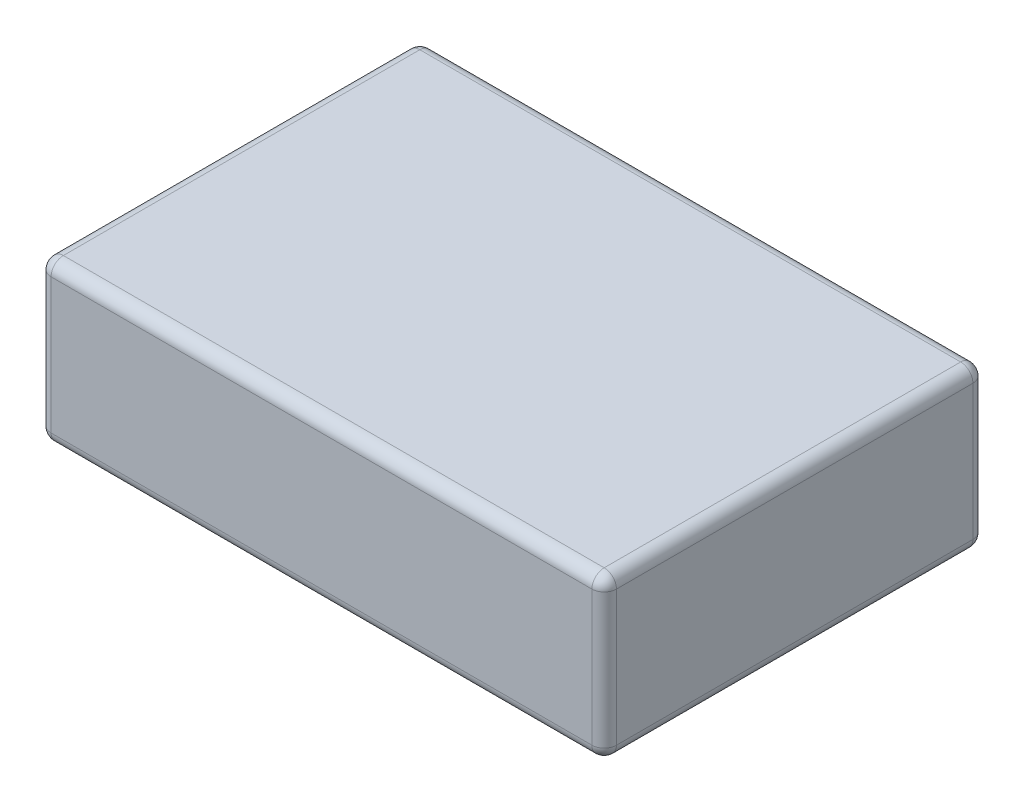
ISO-10303-21;
HEADER;
FILE_DESCRIPTION(('STEP AP214'),'2;1');
FILE_NAME('part.step','',(''),(''),'','','');
FILE_SCHEMA(('AUTOMOTIVE_DESIGN { 1 0 10303 214 1 1 1 1 }'));
ENDSEC;
DATA;
#1=APPLICATION_CONTEXT('core data for automotive mechanical design processes');
#2=APPLICATION_PROTOCOL_DEFINITION('international standard','automotive_design',2000,#1);
#3=PRODUCT_CONTEXT('',#1,'mechanical');
#4=PRODUCT('Part','Part','',(#3));
#5=PRODUCT_RELATED_PRODUCT_CATEGORY('part','',(#4));
#6=PRODUCT_DEFINITION_FORMATION('','',#4);
#7=PRODUCT_DEFINITION_CONTEXT('part definition',#1,'design');
#8=PRODUCT_DEFINITION('design','',#6,#7);
#9=PRODUCT_DEFINITION_SHAPE('','',#8);
#10=(LENGTH_UNIT() NAMED_UNIT(*) SI_UNIT(.MILLI.,.METRE.));
#11=(NAMED_UNIT(*) PLANE_ANGLE_UNIT() SI_UNIT($,.RADIAN.));
#12=(NAMED_UNIT(*) SI_UNIT($,.STERADIAN.) SOLID_ANGLE_UNIT());
#13=UNCERTAINTY_MEASURE_WITH_UNIT(LENGTH_MEASURE(1.E-05),#10,'distance_accuracy_value','');
#14=(GEOMETRIC_REPRESENTATION_CONTEXT(3) GLOBAL_UNCERTAINTY_ASSIGNED_CONTEXT((#13)) GLOBAL_UNIT_ASSIGNED_CONTEXT((#10,
#11,#12)) REPRESENTATION_CONTEXT('',''));
#15=CARTESIAN_POINT('',(0.,0.,0.));
#16=DIRECTION('',(0.,0.,1.));
#17=DIRECTION('',(1.,0.,0.));
#18=AXIS2_PLACEMENT_3D('',#15,#16,#17);
#19=CARTESIAN_POINT('',(46.,26.,-31.));
#20=DIRECTION('',(-1.,0.,0.));
#21=DIRECTION('',(0.,0.,1.));
#22=AXIS2_PLACEMENT_3D('',#19,#20,#21);
#23=PLANE('',#22);
#24=DIRECTION('',(0.,-1.,0.));
#25=VECTOR('',#24,1.);
#26=CARTESIAN_POINT('',(46.,26.,29.));
#27=LINE('',#26,#25);
#28=CARTESIAN_POINT('',(46.,24.,29.));
#29=VERTEX_POINT('',#28);
#30=CARTESIAN_POINT('',(46.,2.,29.));
#31=VERTEX_POINT('',#30);
#32=EDGE_CURVE('E174',#29,#31,#27,.T.);
#33=ORIENTED_EDGE('',*,*,#32,.T.);
#34=DIRECTION('',(0.,0.,-1.));
#35=VECTOR('',#34,1.);
#36=CARTESIAN_POINT('',(46.,2.,-31.));
#37=LINE('',#36,#35);
#38=CARTESIAN_POINT('',(46.,2.,-29.));
#39=VERTEX_POINT('',#38);
#40=EDGE_CURVE('E170',#31,#39,#37,.T.);
#41=ORIENTED_EDGE('',*,*,#40,.T.);
#42=DIRECTION('',(0.,-1.,0.));
#43=VECTOR('',#42,1.);
#44=CARTESIAN_POINT('',(46.,26.,-29.));
#45=LINE('',#44,#43);
#46=CARTESIAN_POINT('',(46.,24.,-29.));
#47=VERTEX_POINT('',#46);
#48=EDGE_CURVE('E165',#39,#47,#45,.F.);
#49=ORIENTED_EDGE('',*,*,#48,.T.);
#50=DIRECTION('',(0.,0.,-1.));
#51=VECTOR('',#50,1.);
#52=CARTESIAN_POINT('',(46.,24.,31.));
#53=LINE('',#52,#51);
#54=EDGE_CURVE('E167',#47,#29,#53,.F.);
#55=ORIENTED_EDGE('',*,*,#54,.T.);
#56=EDGE_LOOP('',(#33,#41,#49,#55));
#57=FACE_BOUND('',#56,.T.);
#58=ADVANCED_FACE('F34',(#57),#23,.F.);
#59=CARTESIAN_POINT('',(-46.,26.,-31.));
#60=DIRECTION('',(0.,0.,1.));
#61=DIRECTION('',(1.,0.,0.));
#62=AXIS2_PLACEMENT_3D('',#59,#60,#61);
#63=PLANE('',#62);
#64=DIRECTION('',(-1.,0.,0.));
#65=VECTOR('',#64,1.);
#66=CARTESIAN_POINT('',(-46.,2.,-31.));
#67=LINE('',#66,#65);
#68=CARTESIAN_POINT('',(44.,2.,-31.));
#69=VERTEX_POINT('',#68);
#70=CARTESIAN_POINT('',(-44.,2.,-31.));
#71=VERTEX_POINT('',#70);
#72=EDGE_CURVE('E313',#69,#71,#67,.T.);
#73=ORIENTED_EDGE('',*,*,#72,.T.);
#74=DIRECTION('',(0.,-1.,0.));
#75=VECTOR('',#74,1.);
#76=CARTESIAN_POINT('',(-44.,26.,-31.));
#77=LINE('',#76,#75);
#78=CARTESIAN_POINT('',(-44.,24.,-31.));
#79=VERTEX_POINT('',#78);
#80=EDGE_CURVE('E316',#71,#79,#77,.F.);
#81=ORIENTED_EDGE('',*,*,#80,.T.);
#82=DIRECTION('',(-1.,0.,0.));
#83=VECTOR('',#82,1.);
#84=CARTESIAN_POINT('',(46.,24.,-31.));
#85=LINE('',#84,#83);
#86=CARTESIAN_POINT('',(44.,24.,-31.));
#87=VERTEX_POINT('',#86);
#88=EDGE_CURVE('E307',#79,#87,#85,.F.);
#89=ORIENTED_EDGE('',*,*,#88,.T.);
#90=DIRECTION('',(0.,-1.,0.));
#91=VECTOR('',#90,1.);
#92=CARTESIAN_POINT('',(44.,26.,-31.));
#93=LINE('',#92,#91);
#94=EDGE_CURVE('E197',#87,#69,#93,.T.);
#95=ORIENTED_EDGE('',*,*,#94,.T.);
#96=EDGE_LOOP('',(#73,#81,#89,#95));
#97=FACE_BOUND('',#96,.T.);
#98=ADVANCED_FACE('F375',(#97),#63,.F.);
#99=CARTESIAN_POINT('',(-46.,26.,-31.));
#100=DIRECTION('',(1.,0.,0.));
#101=DIRECTION('',(0.,0.,-1.));
#102=AXIS2_PLACEMENT_3D('',#99,#100,#101);
#103=PLANE('',#102);
#104=DIRECTION('',(0.,0.,1.));
#105=VECTOR('',#104,1.);
#106=CARTESIAN_POINT('',(-46.,2.,-31.));
#107=LINE('',#106,#105);
#108=CARTESIAN_POINT('',(-46.,2.,-29.));
#109=VERTEX_POINT('',#108);
#110=CARTESIAN_POINT('',(-46.,2.,29.));
#111=VERTEX_POINT('',#110);
#112=EDGE_CURVE('E322',#109,#111,#107,.T.);
#113=ORIENTED_EDGE('',*,*,#112,.T.);
#114=DIRECTION('',(0.,-1.,0.));
#115=VECTOR('',#114,1.);
#116=CARTESIAN_POINT('',(-46.,26.,29.));
#117=LINE('',#116,#115);
#118=CARTESIAN_POINT('',(-46.,24.,29.));
#119=VERTEX_POINT('',#118);
#120=EDGE_CURVE('E325',#111,#119,#117,.F.);
#121=ORIENTED_EDGE('',*,*,#120,.T.);
#122=DIRECTION('',(0.,0.,1.));
#123=VECTOR('',#122,1.);
#124=CARTESIAN_POINT('',(-46.,24.,-31.));
#125=LINE('',#124,#123);
#126=CARTESIAN_POINT('',(-46.,24.,-29.));
#127=VERTEX_POINT('',#126);
#128=EDGE_CURVE('E320',#119,#127,#125,.F.);
#129=ORIENTED_EDGE('',*,*,#128,.T.);
#130=DIRECTION('',(0.,-1.,0.));
#131=VECTOR('',#130,1.);
#132=CARTESIAN_POINT('',(-46.,26.,-29.));
#133=LINE('',#132,#131);
#134=EDGE_CURVE('E318',#127,#109,#133,.T.);
#135=ORIENTED_EDGE('',*,*,#134,.T.);
#136=EDGE_LOOP('',(#113,#121,#129,#135));
#137=FACE_BOUND('',#136,.T.);
#138=ADVANCED_FACE('F379',(#137),#103,.F.);
#139=CARTESIAN_POINT('',(-46.,26.,31.));
#140=DIRECTION('',(0.,0.,-1.));
#141=DIRECTION('',(-1.,0.,0.));
#142=AXIS2_PLACEMENT_3D('',#139,#140,#141);
#143=PLANE('',#142);
#144=DIRECTION('',(1.,0.,0.));
#145=VECTOR('',#144,1.);
#146=CARTESIAN_POINT('',(-46.,2.,31.));
#147=LINE('',#146,#145);
#148=CARTESIAN_POINT('',(-44.,2.,31.));
#149=VERTEX_POINT('',#148);
#150=CARTESIAN_POINT('',(44.,2.,31.));
#151=VERTEX_POINT('',#150);
#152=EDGE_CURVE('E331',#149,#151,#147,.T.);
#153=ORIENTED_EDGE('',*,*,#152,.T.);
#154=DIRECTION('',(0.,-1.,0.));
#155=VECTOR('',#154,1.);
#156=CARTESIAN_POINT('',(44.,26.,31.));
#157=LINE('',#156,#155);
#158=CARTESIAN_POINT('',(44.,24.,31.));
#159=VERTEX_POINT('',#158);
#160=EDGE_CURVE('E334',#151,#159,#157,.F.);
#161=ORIENTED_EDGE('',*,*,#160,.T.);
#162=DIRECTION('',(1.,0.,0.));
#163=VECTOR('',#162,1.);
#164=CARTESIAN_POINT('',(-46.,24.,31.));
#165=LINE('',#164,#163);
#166=CARTESIAN_POINT('',(-44.,24.,31.));
#167=VERTEX_POINT('',#166);
#168=EDGE_CURVE('E329',#159,#167,#165,.F.);
#169=ORIENTED_EDGE('',*,*,#168,.T.);
#170=DIRECTION('',(0.,-1.,0.));
#171=VECTOR('',#170,1.);
#172=CARTESIAN_POINT('',(-44.,26.,31.));
#173=LINE('',#172,#171);
#174=EDGE_CURVE('E327',#167,#149,#173,.T.);
#175=ORIENTED_EDGE('',*,*,#174,.T.);
#176=EDGE_LOOP('',(#153,#161,#169,#175));
#177=FACE_BOUND('',#176,.T.);
#178=ADVANCED_FACE('F385',(#177),#143,.F.);
#179=CARTESIAN_POINT('',(0.,26.,0.));
#180=DIRECTION('',(0.,1.,0.));
#181=DIRECTION('',(0.,0.,1.));
#182=AXIS2_PLACEMENT_3D('',#179,#180,#181);
#183=PLANE('',#182);
#184=DIRECTION('',(0.,0.,-1.));
#185=VECTOR('',#184,1.);
#186=CARTESIAN_POINT('',(44.,26.,-31.));
#187=LINE('',#186,#185);
#188=CARTESIAN_POINT('',(44.,26.,29.));
#189=VERTEX_POINT('',#188);
#190=CARTESIAN_POINT('',(44.,26.,-29.));
#191=VERTEX_POINT('',#190);
#192=EDGE_CURVE('E336',#189,#191,#187,.T.);
#193=ORIENTED_EDGE('',*,*,#192,.T.);
#194=DIRECTION('',(-1.,0.,0.));
#195=VECTOR('',#194,1.);
#196=CARTESIAN_POINT('',(-46.,26.,-29.));
#197=LINE('',#196,#195);
#198=CARTESIAN_POINT('',(-44.,26.,-29.));
#199=VERTEX_POINT('',#198);
#200=EDGE_CURVE('E261',#191,#199,#197,.T.);
#201=ORIENTED_EDGE('',*,*,#200,.T.);
#202=DIRECTION('',(0.,0.,1.));
#203=VECTOR('',#202,1.);
#204=CARTESIAN_POINT('',(-44.,26.,31.));
#205=LINE('',#204,#203);
#206=CARTESIAN_POINT('',(-44.,26.,29.));
#207=VERTEX_POINT('',#206);
#208=EDGE_CURVE('E96',#199,#207,#205,.T.);
#209=ORIENTED_EDGE('',*,*,#208,.T.);
#210=DIRECTION('',(1.,0.,0.));
#211=VECTOR('',#210,1.);
#212=CARTESIAN_POINT('',(46.,26.,29.));
#213=LINE('',#212,#211);
#214=EDGE_CURVE('E265',#207,#189,#213,.T.);
#215=ORIENTED_EDGE('',*,*,#214,.T.);
#216=EDGE_LOOP('',(#193,#201,#209,#215));
#217=FACE_BOUND('',#216,.T.);
#218=ADVANCED_FACE('F338',(#217),#183,.T.);
#219=CARTESIAN_POINT('',(0.,0.,0.));
#220=DIRECTION('',(0.,1.,0.));
#221=DIRECTION('',(0.,0.,1.));
#222=AXIS2_PLACEMENT_3D('',#219,#220,#221);
#223=PLANE('',#222);
#224=DIRECTION('',(-1.,0.,0.));
#225=VECTOR('',#224,1.);
#226=CARTESIAN_POINT('',(0.,0.,-29.));
#227=LINE('',#226,#225);
#228=CARTESIAN_POINT('',(-44.,0.,-29.));
#229=VERTEX_POINT('',#228);
#230=CARTESIAN_POINT('',(44.,0.,-29.));
#231=VERTEX_POINT('',#230);
#232=EDGE_CURVE('E302',#229,#231,#227,.F.);
#233=ORIENTED_EDGE('',*,*,#232,.T.);
#234=DIRECTION('',(0.,0.,-1.));
#235=VECTOR('',#234,1.);
#236=CARTESIAN_POINT('',(44.,0.,0.));
#237=LINE('',#236,#235);
#238=CARTESIAN_POINT('',(44.,0.,29.));
#239=VERTEX_POINT('',#238);
#240=EDGE_CURVE('E299',#231,#239,#237,.F.);
#241=ORIENTED_EDGE('',*,*,#240,.T.);
#242=DIRECTION('',(1.,0.,0.));
#243=VECTOR('',#242,1.);
#244=CARTESIAN_POINT('',(0.,0.,29.));
#245=LINE('',#244,#243);
#246=CARTESIAN_POINT('',(-44.,0.,29.));
#247=VERTEX_POINT('',#246);
#248=EDGE_CURVE('E290',#239,#247,#245,.F.);
#249=ORIENTED_EDGE('',*,*,#248,.T.);
#250=DIRECTION('',(0.,0.,1.));
#251=VECTOR('',#250,1.);
#252=CARTESIAN_POINT('',(-44.,0.,0.));
#253=LINE('',#252,#251);
#254=EDGE_CURVE('E296',#247,#229,#253,.F.);
#255=ORIENTED_EDGE('',*,*,#254,.T.);
#256=EDGE_LOOP('',(#233,#241,#249,#255));
#257=FACE_BOUND('',#256,.T.);
#258=ADVANCED_FACE('F300',(#257),#223,.F.);
#259=CARTESIAN_POINT('',(-44.,24.,0.));
#260=DIRECTION('',(0.,0.,-1.));
#261=DIRECTION('',(-1.,0.,0.));
#262=AXIS2_PLACEMENT_3D('',#259,#260,#261);
#263=CYLINDRICAL_SURFACE('',#262,2.);
#264=CARTESIAN_POINT('',(-44.,24.,29.));
#265=DIRECTION('',(0.,0.,1.));
#266=DIRECTION('',(1.,0.,0.));
#267=AXIS2_PLACEMENT_3D('',#264,#265,#266);
#268=CIRCLE('',#267,2.);
#269=EDGE_CURVE('E186',#207,#119,#268,.T.);
#270=ORIENTED_EDGE('',*,*,#269,.F.);
#271=ORIENTED_EDGE('',*,*,#208,.F.);
#272=CARTESIAN_POINT('',(-44.,24.,-29.));
#273=DIRECTION('',(0.,0.,-1.));
#274=DIRECTION('',(-1.,0.,0.));
#275=AXIS2_PLACEMENT_3D('',#272,#273,#274);
#276=CIRCLE('',#275,2.);
#277=EDGE_CURVE('E236',#127,#199,#276,.T.);
#278=ORIENTED_EDGE('',*,*,#277,.F.);
#279=ORIENTED_EDGE('',*,*,#128,.F.);
#280=EDGE_LOOP('',(#270,#271,#278,#279));
#281=FACE_BOUND('',#280,.T.);
#282=ADVANCED_FACE('F392',(#281),#263,.T.);
#283=CARTESIAN_POINT('',(-44.,24.,29.));
#284=DIRECTION('',(0.,0.,1.));
#285=DIRECTION('',(1.,0.,0.));
#286=AXIS2_PLACEMENT_3D('',#283,#284,#285);
#287=SPHERICAL_SURFACE('',#286,2.);
#288=CARTESIAN_POINT('',(-44.,24.,29.));
#289=DIRECTION('',(-1.,0.,0.));
#290=DIRECTION('',(0.,-1.,0.));
#291=AXIS2_PLACEMENT_3D('',#288,#289,#290);
#292=CIRCLE('',#291,2.);
#293=EDGE_CURVE('E230',#207,#167,#292,.F.);
#294=ORIENTED_EDGE('',*,*,#293,.F.);
#295=ORIENTED_EDGE('',*,*,#269,.T.);
#296=CARTESIAN_POINT('',(-44.,24.,29.));
#297=DIRECTION('',(0.,1.,0.));
#298=DIRECTION('',(0.,0.,1.));
#299=AXIS2_PLACEMENT_3D('',#296,#297,#298);
#300=CIRCLE('',#299,2.);
#301=EDGE_CURVE('E233',#167,#119,#300,.F.);
#302=ORIENTED_EDGE('',*,*,#301,.F.);
#303=EDGE_LOOP('',(#294,#295,#302));
#304=FACE_BOUND('',#303,.T.);
#305=ADVANCED_FACE('F408',(#304),#287,.T.);
#306=CARTESIAN_POINT('',(-44.,24.,-29.));
#307=DIRECTION('',(0.,0.,1.));
#308=DIRECTION('',(1.,0.,0.));
#309=AXIS2_PLACEMENT_3D('',#306,#307,#308);
#310=SPHERICAL_SURFACE('',#309,2.);
#311=CARTESIAN_POINT('',(-44.,24.,-29.));
#312=DIRECTION('',(0.,1.,0.));
#313=DIRECTION('',(0.,0.,1.));
#314=AXIS2_PLACEMENT_3D('',#311,#312,#313);
#315=CIRCLE('',#314,2.);
#316=EDGE_CURVE('E226',#127,#79,#315,.F.);
#317=ORIENTED_EDGE('',*,*,#316,.F.);
#318=ORIENTED_EDGE('',*,*,#277,.T.);
#319=CARTESIAN_POINT('',(-44.,24.,-29.));
#320=DIRECTION('',(-1.,0.,0.));
#321=DIRECTION('',(0.,0.,1.));
#322=AXIS2_PLACEMENT_3D('',#319,#320,#321);
#323=CIRCLE('',#322,2.);
#324=EDGE_CURVE('E88',#79,#199,#323,.F.);
#325=ORIENTED_EDGE('',*,*,#324,.F.);
#326=EDGE_LOOP('',(#317,#318,#325));
#327=FACE_BOUND('',#326,.T.);
#328=ADVANCED_FACE('F416',(#327),#310,.T.);
#329=CARTESIAN_POINT('',(-44.,26.,29.));
#330=DIRECTION('',(0.,-1.,0.));
#331=DIRECTION('',(0.,0.,-1.));
#332=AXIS2_PLACEMENT_3D('',#329,#330,#331);
#333=CYLINDRICAL_SURFACE('',#332,2.);
#334=ORIENTED_EDGE('',*,*,#301,.T.);
#335=ORIENTED_EDGE('',*,*,#120,.F.);
#336=CARTESIAN_POINT('',(-44.,2.,29.));
#337=DIRECTION('',(0.,-1.,0.));
#338=DIRECTION('',(0.,0.,-1.));
#339=AXIS2_PLACEMENT_3D('',#336,#337,#338);
#340=CIRCLE('',#339,2.);
#341=EDGE_CURVE('E221',#149,#111,#340,.T.);
#342=ORIENTED_EDGE('',*,*,#341,.F.);
#343=ORIENTED_EDGE('',*,*,#174,.F.);
#344=EDGE_LOOP('',(#334,#335,#342,#343));
#345=FACE_BOUND('',#344,.T.);
#346=ADVANCED_FACE('F424',(#345),#333,.T.);
#347=CARTESIAN_POINT('',(0.,24.,29.));
#348=DIRECTION('',(-1.,0.,0.));
#349=DIRECTION('',(0.,0.,1.));
#350=AXIS2_PLACEMENT_3D('',#347,#348,#349);
#351=CYLINDRICAL_SURFACE('',#350,2.);
#352=ORIENTED_EDGE('',*,*,#293,.T.);
#353=ORIENTED_EDGE('',*,*,#168,.F.);
#354=CARTESIAN_POINT('',(44.,24.,29.));
#355=DIRECTION('',(1.,0.,0.));
#356=DIRECTION('',(0.,0.,-1.));
#357=AXIS2_PLACEMENT_3D('',#354,#355,#356);
#358=CIRCLE('',#357,2.);
#359=EDGE_CURVE('E218',#189,#159,#358,.T.);
#360=ORIENTED_EDGE('',*,*,#359,.F.);
#361=ORIENTED_EDGE('',*,*,#214,.F.);
#362=EDGE_LOOP('',(#352,#353,#360,#361));
#363=FACE_BOUND('',#362,.T.);
#364=ADVANCED_FACE('F342',(#363),#351,.T.);
#365=CARTESIAN_POINT('',(44.,24.,0.));
#366=DIRECTION('',(0.,0.,1.));
#367=DIRECTION('',(1.,0.,0.));
#368=AXIS2_PLACEMENT_3D('',#365,#366,#367);
#369=CYLINDRICAL_SURFACE('',#368,2.);
#370=CARTESIAN_POINT('',(44.,24.,-29.));
#371=DIRECTION('',(0.,0.,-1.));
#372=DIRECTION('',(-1.,0.,0.));
#373=AXIS2_PLACEMENT_3D('',#370,#371,#372);
#374=CIRCLE('',#373,2.);
#375=EDGE_CURVE('E181',#191,#47,#374,.T.);
#376=ORIENTED_EDGE('',*,*,#375,.F.);
#377=ORIENTED_EDGE('',*,*,#192,.F.);
#378=CARTESIAN_POINT('',(44.,24.,29.));
#379=DIRECTION('',(0.,0.,1.));
#380=DIRECTION('',(1.,0.,0.));
#381=AXIS2_PLACEMENT_3D('',#378,#379,#380);
#382=CIRCLE('',#381,2.);
#383=EDGE_CURVE('E184',#29,#189,#382,.T.);
#384=ORIENTED_EDGE('',*,*,#383,.F.);
#385=ORIENTED_EDGE('',*,*,#54,.F.);
#386=EDGE_LOOP('',(#376,#377,#384,#385));
#387=FACE_BOUND('',#386,.T.);
#388=ADVANCED_FACE('F179',(#387),#369,.T.);
#389=CARTESIAN_POINT('',(0.,24.,-29.));
#390=DIRECTION('',(1.,0.,0.));
#391=DIRECTION('',(0.,0.,-1.));
#392=AXIS2_PLACEMENT_3D('',#389,#390,#391);
#393=CYLINDRICAL_SURFACE('',#392,2.);
#394=ORIENTED_EDGE('',*,*,#324,.T.);
#395=ORIENTED_EDGE('',*,*,#200,.F.);
#396=CARTESIAN_POINT('',(44.,24.,-29.));
#397=DIRECTION('',(1.,0.,0.));
#398=DIRECTION('',(0.,1.,0.));
#399=AXIS2_PLACEMENT_3D('',#396,#397,#398);
#400=CIRCLE('',#399,2.);
#401=EDGE_CURVE('E194',#87,#191,#400,.T.);
#402=ORIENTED_EDGE('',*,*,#401,.F.);
#403=ORIENTED_EDGE('',*,*,#88,.F.);
#404=EDGE_LOOP('',(#394,#395,#402,#403));
#405=FACE_BOUND('',#404,.T.);
#406=ADVANCED_FACE('F445',(#405),#393,.T.);
#407=CARTESIAN_POINT('',(-44.,26.,-29.));
#408=DIRECTION('',(0.,-1.,0.));
#409=DIRECTION('',(0.,0.,-1.));
#410=AXIS2_PLACEMENT_3D('',#407,#408,#409);
#411=CYLINDRICAL_SURFACE('',#410,2.);
#412=ORIENTED_EDGE('',*,*,#316,.T.);
#413=ORIENTED_EDGE('',*,*,#80,.F.);
#414=CARTESIAN_POINT('',(-44.,2.,-29.));
#415=DIRECTION('',(0.,-1.,0.));
#416=DIRECTION('',(0.,0.,-1.));
#417=AXIS2_PLACEMENT_3D('',#414,#415,#416);
#418=CIRCLE('',#417,2.);
#419=EDGE_CURVE('E213',#109,#71,#418,.T.);
#420=ORIENTED_EDGE('',*,*,#419,.F.);
#421=ORIENTED_EDGE('',*,*,#134,.F.);
#422=EDGE_LOOP('',(#412,#413,#420,#421));
#423=FACE_BOUND('',#422,.T.);
#424=ADVANCED_FACE('F452',(#423),#411,.T.);
#425=CARTESIAN_POINT('',(-44.,2.,-31.));
#426=DIRECTION('',(0.,0.,1.));
#427=DIRECTION('',(1.,0.,0.));
#428=AXIS2_PLACEMENT_3D('',#425,#426,#427);
#429=CYLINDRICAL_SURFACE('',#428,2.);
#430=CARTESIAN_POINT('',(-44.,2.,29.));
#431=DIRECTION('',(0.,0.,1.));
#432=DIRECTION('',(1.,0.,0.));
#433=AXIS2_PLACEMENT_3D('',#430,#431,#432);
#434=CIRCLE('',#433,2.);
#435=EDGE_CURVE('E223',#111,#247,#434,.T.);
#436=ORIENTED_EDGE('',*,*,#435,.F.);
#437=ORIENTED_EDGE('',*,*,#112,.F.);
#438=CARTESIAN_POINT('',(-44.,2.,-29.));
#439=DIRECTION('',(0.,0.,-1.));
#440=DIRECTION('',(-1.,0.,0.));
#441=AXIS2_PLACEMENT_3D('',#438,#439,#440);
#442=CIRCLE('',#441,2.);
#443=EDGE_CURVE('E210',#229,#109,#442,.T.);
#444=ORIENTED_EDGE('',*,*,#443,.F.);
#445=ORIENTED_EDGE('',*,*,#254,.F.);
#446=EDGE_LOOP('',(#436,#437,#444,#445));
#447=FACE_BOUND('',#446,.T.);
#448=ADVANCED_FACE('F355',(#447),#429,.T.);
#449=CARTESIAN_POINT('',(-44.,2.,29.));
#450=DIRECTION('',(0.,0.,1.));
#451=DIRECTION('',(1.,0.,0.));
#452=AXIS2_PLACEMENT_3D('',#449,#450,#451);
#453=SPHERICAL_SURFACE('',#452,2.);
#454=ORIENTED_EDGE('',*,*,#341,.T.);
#455=ORIENTED_EDGE('',*,*,#435,.T.);
#456=CARTESIAN_POINT('',(-44.,2.,29.));
#457=DIRECTION('',(-1.,0.,0.));
#458=DIRECTION('',(0.,0.,1.));
#459=AXIS2_PLACEMENT_3D('',#456,#457,#458);
#460=CIRCLE('',#459,2.);
#461=EDGE_CURVE('E202',#149,#247,#460,.F.);
#462=ORIENTED_EDGE('',*,*,#461,.F.);
#463=EDGE_LOOP('',(#454,#455,#462));
#464=FACE_BOUND('',#463,.T.);
#465=ADVANCED_FACE('F466',(#464),#453,.T.);
#466=CARTESIAN_POINT('',(44.,24.,29.));
#467=DIRECTION('',(0.,0.,1.));
#468=DIRECTION('',(1.,0.,0.));
#469=AXIS2_PLACEMENT_3D('',#466,#467,#468);
#470=SPHERICAL_SURFACE('',#469,2.);
#471=ORIENTED_EDGE('',*,*,#383,.T.);
#472=ORIENTED_EDGE('',*,*,#359,.T.);
#473=CARTESIAN_POINT('',(44.,24.,29.));
#474=DIRECTION('',(0.,1.,0.));
#475=DIRECTION('',(0.,0.,1.));
#476=AXIS2_PLACEMENT_3D('',#473,#474,#475);
#477=CIRCLE('',#476,2.);
#478=EDGE_CURVE('E198',#29,#159,#477,.F.);
#479=ORIENTED_EDGE('',*,*,#478,.F.);
#480=EDGE_LOOP('',(#471,#472,#479));
#481=FACE_BOUND('',#480,.T.);
#482=ADVANCED_FACE('F344',(#481),#470,.T.);
#483=CARTESIAN_POINT('',(44.,24.,-29.));
#484=DIRECTION('',(0.,0.,1.));
#485=DIRECTION('',(1.,0.,0.));
#486=AXIS2_PLACEMENT_3D('',#483,#484,#485);
#487=SPHERICAL_SURFACE('',#486,2.);
#488=ORIENTED_EDGE('',*,*,#401,.T.);
#489=ORIENTED_EDGE('',*,*,#375,.T.);
#490=CARTESIAN_POINT('',(44.,24.,-29.));
#491=DIRECTION('',(0.,1.,0.));
#492=DIRECTION('',(0.,0.,1.));
#493=AXIS2_PLACEMENT_3D('',#490,#491,#492);
#494=CIRCLE('',#493,2.);
#495=EDGE_CURVE('E191',#87,#47,#494,.F.);
#496=ORIENTED_EDGE('',*,*,#495,.F.);
#497=EDGE_LOOP('',(#488,#489,#496));
#498=FACE_BOUND('',#497,.T.);
#499=ADVANCED_FACE('F190',(#498),#487,.T.);
#500=CARTESIAN_POINT('',(-44.,2.,-29.));
#501=DIRECTION('',(0.,0.,1.));
#502=DIRECTION('',(1.,0.,0.));
#503=AXIS2_PLACEMENT_3D('',#500,#501,#502);
#504=SPHERICAL_SURFACE('',#503,2.);
#505=ORIENTED_EDGE('',*,*,#443,.T.);
#506=ORIENTED_EDGE('',*,*,#419,.T.);
#507=CARTESIAN_POINT('',(-44.,2.,-29.));
#508=DIRECTION('',(-1.,0.,0.));
#509=DIRECTION('',(0.,0.,1.));
#510=AXIS2_PLACEMENT_3D('',#507,#508,#509);
#511=CIRCLE('',#510,2.);
#512=EDGE_CURVE('E199',#229,#71,#511,.F.);
#513=ORIENTED_EDGE('',*,*,#512,.F.);
#514=EDGE_LOOP('',(#505,#506,#513));
#515=FACE_BOUND('',#514,.T.);
#516=ADVANCED_FACE('F358',(#515),#504,.T.);
#517=CARTESIAN_POINT('',(-46.,2.,29.));
#518=DIRECTION('',(1.,0.,0.));
#519=DIRECTION('',(0.,0.,-1.));
#520=AXIS2_PLACEMENT_3D('',#517,#518,#519);
#521=CYLINDRICAL_SURFACE('',#520,2.);
#522=ORIENTED_EDGE('',*,*,#461,.T.);
#523=ORIENTED_EDGE('',*,*,#248,.F.);
#524=CARTESIAN_POINT('',(44.,2.,29.));
#525=DIRECTION('',(1.,0.,0.));
#526=DIRECTION('',(0.,0.,-1.));
#527=AXIS2_PLACEMENT_3D('',#524,#525,#526);
#528=CIRCLE('',#527,2.);
#529=EDGE_CURVE('E204',#151,#239,#528,.T.);
#530=ORIENTED_EDGE('',*,*,#529,.F.);
#531=ORIENTED_EDGE('',*,*,#152,.F.);
#532=EDGE_LOOP('',(#522,#523,#530,#531));
#533=FACE_BOUND('',#532,.T.);
#534=ADVANCED_FACE('F292',(#533),#521,.T.);
#535=CARTESIAN_POINT('',(44.,26.,29.));
#536=DIRECTION('',(0.,-1.,0.));
#537=DIRECTION('',(0.,0.,-1.));
#538=AXIS2_PLACEMENT_3D('',#535,#536,#537);
#539=CYLINDRICAL_SURFACE('',#538,2.);
#540=ORIENTED_EDGE('',*,*,#478,.T.);
#541=ORIENTED_EDGE('',*,*,#160,.F.);
#542=CARTESIAN_POINT('',(44.,2.,29.));
#543=DIRECTION('',(0.,-1.,0.));
#544=DIRECTION('',(0.,0.,-1.));
#545=AXIS2_PLACEMENT_3D('',#542,#543,#544);
#546=CIRCLE('',#545,2.);
#547=EDGE_CURVE('E279',#31,#151,#546,.T.);
#548=ORIENTED_EDGE('',*,*,#547,.F.);
#549=ORIENTED_EDGE('',*,*,#32,.F.);
#550=EDGE_LOOP('',(#540,#541,#548,#549));
#551=FACE_BOUND('',#550,.T.);
#552=ADVANCED_FACE('F347',(#551),#539,.T.);
#553=CARTESIAN_POINT('',(44.,26.,-29.));
#554=DIRECTION('',(0.,-1.,0.));
#555=DIRECTION('',(0.,0.,-1.));
#556=AXIS2_PLACEMENT_3D('',#553,#554,#555);
#557=CYLINDRICAL_SURFACE('',#556,2.);
#558=ORIENTED_EDGE('',*,*,#495,.T.);
#559=ORIENTED_EDGE('',*,*,#48,.F.);
#560=CARTESIAN_POINT('',(44.,2.,-29.));
#561=DIRECTION('',(0.,-1.,0.));
#562=DIRECTION('',(0.,0.,-1.));
#563=AXIS2_PLACEMENT_3D('',#560,#561,#562);
#564=CIRCLE('',#563,2.);
#565=EDGE_CURVE('E276',#69,#39,#564,.T.);
#566=ORIENTED_EDGE('',*,*,#565,.F.);
#567=ORIENTED_EDGE('',*,*,#94,.F.);
#568=EDGE_LOOP('',(#558,#559,#566,#567));
#569=FACE_BOUND('',#568,.T.);
#570=ADVANCED_FACE('F196',(#569),#557,.T.);
#571=CARTESIAN_POINT('',(-46.,2.,-29.));
#572=DIRECTION('',(-1.,0.,0.));
#573=DIRECTION('',(0.,0.,1.));
#574=AXIS2_PLACEMENT_3D('',#571,#572,#573);
#575=CYLINDRICAL_SURFACE('',#574,2.);
#576=ORIENTED_EDGE('',*,*,#512,.T.);
#577=ORIENTED_EDGE('',*,*,#72,.F.);
#578=CARTESIAN_POINT('',(44.,2.,-29.));
#579=DIRECTION('',(1.,0.,0.));
#580=DIRECTION('',(0.,0.,-1.));
#581=AXIS2_PLACEMENT_3D('',#578,#579,#580);
#582=CIRCLE('',#581,2.);
#583=EDGE_CURVE('E273',#231,#69,#582,.T.);
#584=ORIENTED_EDGE('',*,*,#583,.F.);
#585=ORIENTED_EDGE('',*,*,#232,.F.);
#586=EDGE_LOOP('',(#576,#577,#584,#585));
#587=FACE_BOUND('',#586,.T.);
#588=ADVANCED_FACE('F362',(#587),#575,.T.);
#589=CARTESIAN_POINT('',(44.,2.,29.));
#590=DIRECTION('',(0.,0.,1.));
#591=DIRECTION('',(1.,0.,0.));
#592=AXIS2_PLACEMENT_3D('',#589,#590,#591);
#593=SPHERICAL_SURFACE('',#592,2.);
#594=ORIENTED_EDGE('',*,*,#547,.T.);
#595=ORIENTED_EDGE('',*,*,#529,.T.);
#596=CARTESIAN_POINT('',(44.,2.,29.));
#597=DIRECTION('',(0.,0.,1.));
#598=DIRECTION('',(1.,0.,0.));
#599=AXIS2_PLACEMENT_3D('',#596,#597,#598);
#600=CIRCLE('',#599,2.);
#601=EDGE_CURVE('E271',#31,#239,#600,.F.);
#602=ORIENTED_EDGE('',*,*,#601,.F.);
#603=EDGE_LOOP('',(#594,#595,#602));
#604=FACE_BOUND('',#603,.T.);
#605=ADVANCED_FACE('F285',(#604),#593,.T.);
#606=CARTESIAN_POINT('',(44.,2.,-29.));
#607=DIRECTION('',(0.,0.,1.));
#608=DIRECTION('',(1.,0.,0.));
#609=AXIS2_PLACEMENT_3D('',#606,#607,#608);
#610=SPHERICAL_SURFACE('',#609,2.);
#611=ORIENTED_EDGE('',*,*,#583,.T.);
#612=ORIENTED_EDGE('',*,*,#565,.T.);
#613=CARTESIAN_POINT('',(44.,2.,-29.));
#614=DIRECTION('',(0.,0.,-1.));
#615=DIRECTION('',(-1.,0.,0.));
#616=AXIS2_PLACEMENT_3D('',#613,#614,#615);
#617=CIRCLE('',#616,2.);
#618=EDGE_CURVE('E269',#231,#39,#617,.F.);
#619=ORIENTED_EDGE('',*,*,#618,.F.);
#620=EDGE_LOOP('',(#611,#612,#619));
#621=FACE_BOUND('',#620,.T.);
#622=ADVANCED_FACE('F364',(#621),#610,.T.);
#623=CARTESIAN_POINT('',(44.,2.,-31.));
#624=DIRECTION('',(0.,0.,-1.));
#625=DIRECTION('',(-1.,0.,0.));
#626=AXIS2_PLACEMENT_3D('',#623,#624,#625);
#627=CYLINDRICAL_SURFACE('',#626,2.);
#628=ORIENTED_EDGE('',*,*,#601,.T.);
#629=ORIENTED_EDGE('',*,*,#240,.F.);
#630=ORIENTED_EDGE('',*,*,#618,.T.);
#631=ORIENTED_EDGE('',*,*,#40,.F.);
#632=EDGE_LOOP('',(#628,#629,#630,#631));
#633=FACE_BOUND('',#632,.T.);
#634=ADVANCED_FACE('F365',(#633),#627,.T.);
#635=CLOSED_SHELL('',(#58,#98,#138,#178,#218,#258,#282,#305,#328,#346,#364,#388,#406,#424,#448,
#465,#482,#499,#516,#534,#552,#570,#588,#605,#622,#634));
#636=CARTESIAN_POINT('',(44.,26.,-31.));
#637=DIRECTION('',(-1.,0.,0.));
#638=DIRECTION('',(0.,0.,1.));
#639=AXIS2_PLACEMENT_3D('',#636,#637,#638);
#640=PLANE('',#639);
#641=DIRECTION('',(0.,1.,0.));
#642=VECTOR('',#641,1.);
#643=CARTESIAN_POINT('',(44.,26.,29.));
#644=LINE('',#643,#642);
#645=CARTESIAN_POINT('',(44.,2.,29.));
#646=VERTEX_POINT('',#645);
#647=CARTESIAN_POINT('',(44.,24.,29.));
#648=VERTEX_POINT('',#647);
#649=EDGE_CURVE('E80',#646,#648,#644,.T.);
#650=ORIENTED_EDGE('',*,*,#649,.T.);
#651=DIRECTION('',(0.,0.,-1.));
#652=VECTOR('',#651,1.);
#653=CARTESIAN_POINT('',(44.,24.,-31.));
#654=LINE('',#653,#652);
#655=CARTESIAN_POINT('',(44.,24.,-29.));
#656=VERTEX_POINT('',#655);
#657=EDGE_CURVE('E75',#648,#656,#654,.T.);
#658=ORIENTED_EDGE('',*,*,#657,.T.);
#659=DIRECTION('',(0.,1.,0.));
#660=VECTOR('',#659,1.);
#661=CARTESIAN_POINT('',(44.,26.,-29.));
#662=LINE('',#661,#660);
#663=CARTESIAN_POINT('',(44.,2.,-29.));
#664=VERTEX_POINT('',#663);
#665=EDGE_CURVE('E38',#664,#656,#662,.T.);
#666=ORIENTED_EDGE('',*,*,#665,.F.);
#667=DIRECTION('',(0.,0.,1.));
#668=VECTOR('',#667,1.);
#669=CARTESIAN_POINT('',(44.,2.,0.));
#670=LINE('',#669,#668);
#671=EDGE_CURVE('E45',#664,#646,#670,.T.);
#672=ORIENTED_EDGE('',*,*,#671,.T.);
#673=EDGE_LOOP('',(#650,#658,#666,#672));
#674=FACE_BOUND('',#673,.T.);
#675=ADVANCED_FACE('F536',(#674),#640,.T.);
#676=CARTESIAN_POINT('',(-46.,26.,-29.));
#677=DIRECTION('',(0.,0.,1.));
#678=DIRECTION('',(1.,0.,0.));
#679=AXIS2_PLACEMENT_3D('',#676,#677,#678);
#680=PLANE('',#679);
#681=DIRECTION('',(-1.,0.,0.));
#682=VECTOR('',#681,1.);
#683=CARTESIAN_POINT('',(-46.,2.,-29.));
#684=LINE('',#683,#682);
#685=CARTESIAN_POINT('',(-44.,2.,-29.));
#686=VERTEX_POINT('',#685);
#687=EDGE_CURVE('E256',#664,#686,#684,.T.);
#688=ORIENTED_EDGE('',*,*,#687,.F.);
#689=ORIENTED_EDGE('',*,*,#665,.T.);
#690=DIRECTION('',(-1.,0.,0.));
#691=VECTOR('',#690,1.);
#692=CARTESIAN_POINT('',(-46.,24.,-29.));
#693=LINE('',#692,#691);
#694=CARTESIAN_POINT('',(-44.,24.,-29.));
#695=VERTEX_POINT('',#694);
#696=EDGE_CURVE('E244',#656,#695,#693,.T.);
#697=ORIENTED_EDGE('',*,*,#696,.T.);
#698=DIRECTION('',(0.,1.,0.));
#699=VECTOR('',#698,1.);
#700=CARTESIAN_POINT('',(-44.,26.,-29.));
#701=LINE('',#700,#699);
#702=EDGE_CURVE('E255',#686,#695,#701,.T.);
#703=ORIENTED_EDGE('',*,*,#702,.F.);
#704=EDGE_LOOP('',(#688,#689,#697,#703));
#705=FACE_BOUND('',#704,.T.);
#706=ADVANCED_FACE('F539',(#705),#680,.T.);
#707=CARTESIAN_POINT('',(-44.,26.,-31.));
#708=DIRECTION('',(1.,0.,0.));
#709=DIRECTION('',(0.,0.,-1.));
#710=AXIS2_PLACEMENT_3D('',#707,#708,#709);
#711=PLANE('',#710);
#712=DIRECTION('',(0.,0.,1.));
#713=VECTOR('',#712,1.);
#714=CARTESIAN_POINT('',(-44.,2.,-31.));
#715=LINE('',#714,#713);
#716=CARTESIAN_POINT('',(-44.,2.,29.));
#717=VERTEX_POINT('',#716);
#718=EDGE_CURVE('E54',#686,#717,#715,.T.);
#719=ORIENTED_EDGE('',*,*,#718,.F.);
#720=ORIENTED_EDGE('',*,*,#702,.T.);
#721=DIRECTION('',(0.,0.,1.));
#722=VECTOR('',#721,1.);
#723=CARTESIAN_POINT('',(-44.,24.,-31.));
#724=LINE('',#723,#722);
#725=CARTESIAN_POINT('',(-44.,24.,29.));
#726=VERTEX_POINT('',#725);
#727=EDGE_CURVE('E241',#695,#726,#724,.T.);
#728=ORIENTED_EDGE('',*,*,#727,.T.);
#729=DIRECTION('',(0.,1.,0.));
#730=VECTOR('',#729,1.);
#731=CARTESIAN_POINT('',(-44.,26.,29.));
#732=LINE('',#731,#730);
#733=EDGE_CURVE('E251',#717,#726,#732,.T.);
#734=ORIENTED_EDGE('',*,*,#733,.F.);
#735=EDGE_LOOP('',(#719,#720,#728,#734));
#736=FACE_BOUND('',#735,.T.);
#737=ADVANCED_FACE('F550',(#736),#711,.T.);
#738=CARTESIAN_POINT('',(-46.,26.,29.));
#739=DIRECTION('',(0.,0.,-1.));
#740=DIRECTION('',(-1.,0.,0.));
#741=AXIS2_PLACEMENT_3D('',#738,#739,#740);
#742=PLANE('',#741);
#743=DIRECTION('',(-1.,0.,0.));
#744=VECTOR('',#743,1.);
#745=CARTESIAN_POINT('',(0.,2.,29.));
#746=LINE('',#745,#744);
#747=EDGE_CURVE('E11',#646,#717,#746,.T.);
#748=ORIENTED_EDGE('',*,*,#747,.T.);
#749=ORIENTED_EDGE('',*,*,#733,.T.);
#750=DIRECTION('',(-1.,0.,0.));
#751=VECTOR('',#750,1.);
#752=CARTESIAN_POINT('',(0.,24.,29.));
#753=LINE('',#752,#751);
#754=EDGE_CURVE('E248',#648,#726,#753,.T.);
#755=ORIENTED_EDGE('',*,*,#754,.F.);
#756=ORIENTED_EDGE('',*,*,#649,.F.);
#757=EDGE_LOOP('',(#748,#749,#755,#756));
#758=FACE_BOUND('',#757,.T.);
#759=ADVANCED_FACE('F559',(#758),#742,.T.);
#760=CARTESIAN_POINT('',(0.,24.,0.));
#761=DIRECTION('',(0.,1.,0.));
#762=DIRECTION('',(0.,0.,1.));
#763=AXIS2_PLACEMENT_3D('',#760,#761,#762);
#764=PLANE('',#763);
#765=ORIENTED_EDGE('',*,*,#657,.F.);
#766=ORIENTED_EDGE('',*,*,#754,.T.);
#767=ORIENTED_EDGE('',*,*,#727,.F.);
#768=ORIENTED_EDGE('',*,*,#696,.F.);
#769=EDGE_LOOP('',(#765,#766,#767,#768));
#770=FACE_BOUND('',#769,.T.);
#771=ADVANCED_FACE('F568',(#770),#764,.F.);
#772=CARTESIAN_POINT('',(0.,2.,0.));
#773=DIRECTION('',(0.,1.,0.));
#774=DIRECTION('',(0.,0.,1.));
#775=AXIS2_PLACEMENT_3D('',#772,#773,#774);
#776=PLANE('',#775);
#777=ORIENTED_EDGE('',*,*,#687,.T.);
#778=ORIENTED_EDGE('',*,*,#718,.T.);
#779=ORIENTED_EDGE('',*,*,#747,.F.);
#780=ORIENTED_EDGE('',*,*,#671,.F.);
#781=EDGE_LOOP('',(#777,#778,#779,#780));
#782=FACE_BOUND('',#781,.T.);
#783=ADVANCED_FACE('F36',(#782),#776,.T.);
#784=CLOSED_SHELL('',(#675,#706,#737,#759,#771,#783));
#785=ORIENTED_CLOSED_SHELL('',*,#784,.T.);
#786=BREP_WITH_VOIDS('B2',#635,(#785));
#787=ADVANCED_BREP_SHAPE_REPRESENTATION('',(#18,#786),#14);
#788=SHAPE_DEFINITION_REPRESENTATION(#9,#787);
ENDSEC;
END-ISO-10303-21;
